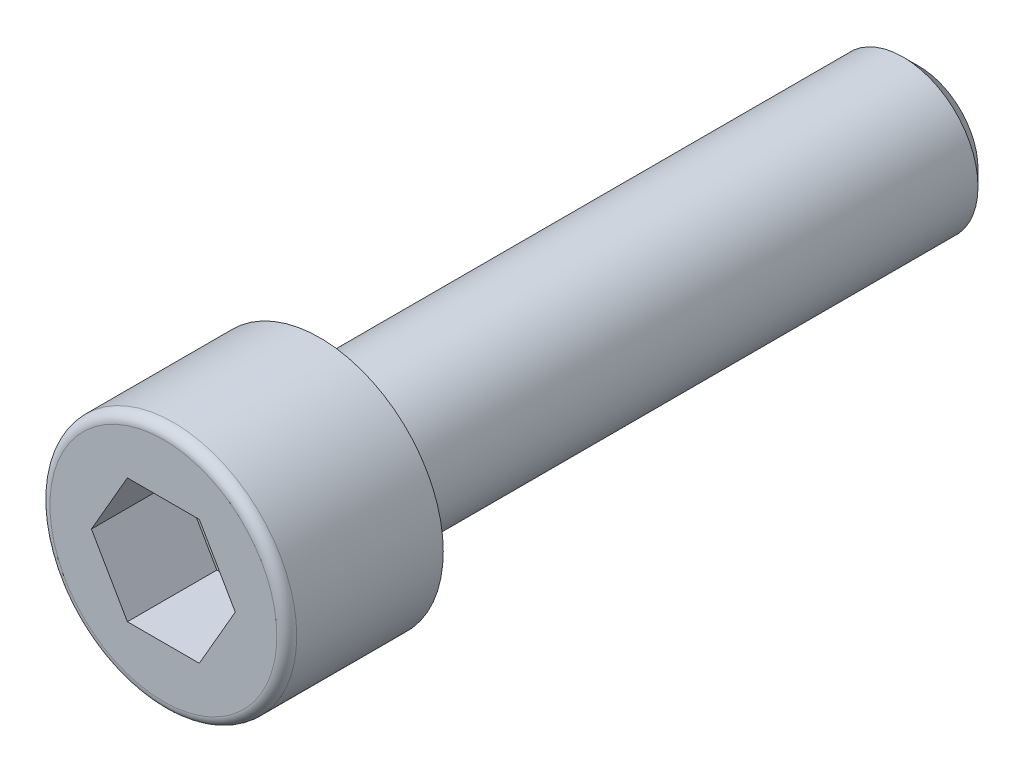
ISO-10303-21;
HEADER;
FILE_DESCRIPTION(('STEP AP214'),'2;1');
FILE_NAME('part.step','',(''),(''),'','','');
FILE_SCHEMA(('AUTOMOTIVE_DESIGN { 1 0 10303 214 1 1 1 1 }'));
ENDSEC;
DATA;
#1=APPLICATION_CONTEXT('core data for automotive mechanical design processes');
#2=APPLICATION_PROTOCOL_DEFINITION('international standard','automotive_design',2000,#1);
#3=PRODUCT_CONTEXT('',#1,'mechanical');
#4=PRODUCT('Part','Part','',(#3));
#5=PRODUCT_RELATED_PRODUCT_CATEGORY('part','',(#4));
#6=PRODUCT_DEFINITION_FORMATION('','',#4);
#7=PRODUCT_DEFINITION_CONTEXT('part definition',#1,'design');
#8=PRODUCT_DEFINITION('design','',#6,#7);
#9=PRODUCT_DEFINITION_SHAPE('','',#8);
#10=(LENGTH_UNIT() NAMED_UNIT(*) SI_UNIT(.MILLI.,.METRE.));
#11=(NAMED_UNIT(*) PLANE_ANGLE_UNIT() SI_UNIT($,.RADIAN.));
#12=(NAMED_UNIT(*) SI_UNIT($,.STERADIAN.) SOLID_ANGLE_UNIT());
#13=UNCERTAINTY_MEASURE_WITH_UNIT(LENGTH_MEASURE(1.E-05),#10,'distance_accuracy_value','');
#14=(GEOMETRIC_REPRESENTATION_CONTEXT(3) GLOBAL_UNCERTAINTY_ASSIGNED_CONTEXT((#13)) GLOBAL_UNIT_ASSIGNED_CONTEXT((#10,
#11,#12)) REPRESENTATION_CONTEXT('',''));
#15=CARTESIAN_POINT('',(0.,0.,0.));
#16=DIRECTION('',(0.,0.,1.));
#17=DIRECTION('',(1.,0.,0.));
#18=AXIS2_PLACEMENT_3D('',#15,#16,#17);
#19=CARTESIAN_POINT('',(0.,0.,2.1336));
#20=DIRECTION('',(0.,0.,1.));
#21=DIRECTION('',(1.,0.,0.));
#22=AXIS2_PLACEMENT_3D('',#19,#20,#21);
#23=PLANE('',#22);
#24=DIRECTION('',(0.500000000000017,-0.866025403784429,0.));
#25=VECTOR('',#24,1.);
#26=CARTESIAN_POINT('',(2.28769270663693,0.,2.1336));
#27=LINE('',#26,#25);
#28=CARTESIAN_POINT('',(1.14384635331845,1.98119999999999,2.1336));
#29=VERTEX_POINT('',#28);
#30=CARTESIAN_POINT('',(2.28769270663695,0.,2.1336));
#31=VERTEX_POINT('',#30);
#32=EDGE_CURVE('E188',#29,#31,#27,.T.);
#33=ORIENTED_EDGE('',*,*,#32,.F.);
#34=DIRECTION('',(1.,0.,0.));
#35=VECTOR('',#34,1.);
#36=CARTESIAN_POINT('',(1.14384635331847,1.9812,2.1336));
#37=LINE('',#36,#35);
#38=CARTESIAN_POINT('',(-1.14384635331847,1.9812,2.1336));
#39=VERTEX_POINT('',#38);
#40=EDGE_CURVE('E193',#39,#29,#37,.T.);
#41=ORIENTED_EDGE('',*,*,#40,.F.);
#42=DIRECTION('',(0.500000000000017,0.866025403784429,0.));
#43=VECTOR('',#42,1.);
#44=CARTESIAN_POINT('',(-1.14384635331847,1.9812,2.1336));
#45=LINE('',#44,#43);
#46=CARTESIAN_POINT('',(-2.28769270663695,0.,2.1336));
#47=VERTEX_POINT('',#46);
#48=EDGE_CURVE('E84',#47,#39,#45,.T.);
#49=ORIENTED_EDGE('',*,*,#48,.F.);
#50=DIRECTION('',(-0.500000000000017,0.866025403784429,0.));
#51=VECTOR('',#50,1.);
#52=CARTESIAN_POINT('',(-2.28769270663693,0.,2.1336));
#53=LINE('',#52,#51);
#54=CARTESIAN_POINT('',(-1.14384635331845,-1.98119999999999,2.1336));
#55=VERTEX_POINT('',#54);
#56=EDGE_CURVE('E65',#55,#47,#53,.T.);
#57=ORIENTED_EDGE('',*,*,#56,.F.);
#58=DIRECTION('',(1.,0.,0.));
#59=VECTOR('',#58,1.);
#60=CARTESIAN_POINT('',(-1.14384635331847,-1.9812,2.1336));
#61=LINE('',#60,#59);
#62=CARTESIAN_POINT('',(1.14384635331847,-1.9812,2.1336));
#63=VERTEX_POINT('',#62);
#64=EDGE_CURVE('E71',#63,#55,#61,.F.);
#65=ORIENTED_EDGE('',*,*,#64,.F.);
#66=DIRECTION('',(-0.500000000000017,-0.866025403784429,0.));
#67=VECTOR('',#66,1.);
#68=CARTESIAN_POINT('',(1.14384635331847,-1.9812,2.1336));
#69=LINE('',#68,#67);
#70=EDGE_CURVE('E183',#31,#63,#69,.T.);
#71=ORIENTED_EDGE('',*,*,#70,.F.);
#72=EDGE_LOOP('',(#33,#41,#49,#57,#65,#71));
#73=FACE_BOUND('',#72,.T.);
#74=ADVANCED_FACE('F16',(#73),#23,.T.);
#75=CARTESIAN_POINT('',(-1.14384635331847,-1.9812,4.9784));
#76=DIRECTION('',(0.,1.,0.));
#77=DIRECTION('',(0.,0.,1.));
#78=AXIS2_PLACEMENT_3D('',#75,#76,#77);
#79=PLANE('',#78);
#80=DIRECTION('',(0.,0.,1.));
#81=VECTOR('',#80,1.);
#82=CARTESIAN_POINT('',(-1.14384635331841,-1.98119999999997,4.9784));
#83=LINE('',#82,#81);
#84=CARTESIAN_POINT('',(-1.14384635331845,-1.98119999999999,4.9784));
#85=VERTEX_POINT('',#84);
#86=EDGE_CURVE('E74',#85,#55,#83,.F.);
#87=ORIENTED_EDGE('',*,*,#86,.F.);
#88=DIRECTION('',(1.,0.,0.));
#89=VECTOR('',#88,1.);
#90=CARTESIAN_POINT('',(0.,-1.9812,4.9784));
#91=LINE('',#90,#89);
#92=CARTESIAN_POINT('',(1.14384635331847,-1.9812,4.9784));
#93=VERTEX_POINT('',#92);
#94=EDGE_CURVE('E172',#93,#85,#91,.F.);
#95=ORIENTED_EDGE('',*,*,#94,.F.);
#96=DIRECTION('',(0.,0.,1.));
#97=VECTOR('',#96,1.);
#98=CARTESIAN_POINT('',(1.14384635331847,-1.9812,4.9784));
#99=LINE('',#98,#97);
#100=EDGE_CURVE('E77',#63,#93,#99,.T.);
#101=ORIENTED_EDGE('',*,*,#100,.F.);
#102=ORIENTED_EDGE('',*,*,#64,.T.);
#103=EDGE_LOOP('',(#87,#95,#101,#102));
#104=FACE_BOUND('',#103,.T.);
#105=ADVANCED_FACE('F72',(#104),#79,.T.);
#106=CARTESIAN_POINT('',(-2.28769270663693,0.,4.9784));
#107=DIRECTION('',(0.866025403784429,0.500000000000017,0.));
#108=DIRECTION('',(-0.500000000000017,0.866025403784429,0.));
#109=AXIS2_PLACEMENT_3D('',#106,#107,#108);
#110=PLANE('',#109);
#111=DIRECTION('',(0.,0.,1.));
#112=VECTOR('',#111,1.);
#113=CARTESIAN_POINT('',(-2.28769270663699,0.,4.9784));
#114=LINE('',#113,#112);
#115=CARTESIAN_POINT('',(-2.28769270663695,0.,4.9784));
#116=VERTEX_POINT('',#115);
#117=EDGE_CURVE('E86',#116,#47,#114,.F.);
#118=ORIENTED_EDGE('',*,*,#117,.F.);
#119=DIRECTION('',(-0.499999999999993,0.866025403784443,0.));
#120=VECTOR('',#119,1.);
#121=CARTESIAN_POINT('',(-1.14384635331847,-1.9812,4.9784));
#122=LINE('',#121,#120);
#123=EDGE_CURVE('E90',#85,#116,#122,.T.);
#124=ORIENTED_EDGE('',*,*,#123,.F.);
#125=ORIENTED_EDGE('',*,*,#86,.T.);
#126=ORIENTED_EDGE('',*,*,#56,.T.);
#127=EDGE_LOOP('',(#118,#124,#125,#126));
#128=FACE_BOUND('',#127,.T.);
#129=ADVANCED_FACE('F88',(#128),#110,.T.);
#130=CARTESIAN_POINT('',(-1.14384635331847,1.9812,4.9784));
#131=DIRECTION('',(0.866025403784429,-0.500000000000017,0.));
#132=DIRECTION('',(0.500000000000017,0.866025403784429,0.));
#133=AXIS2_PLACEMENT_3D('',#130,#131,#132);
#134=PLANE('',#133);
#135=DIRECTION('',(0.,0.,-1.));
#136=VECTOR('',#135,1.);
#137=CARTESIAN_POINT('',(-1.14384635331847,1.9812,4.9784));
#138=LINE('',#137,#136);
#139=CARTESIAN_POINT('',(-1.14384635331847,1.9812,4.9784));
#140=VERTEX_POINT('',#139);
#141=EDGE_CURVE('E195',#140,#39,#138,.T.);
#142=ORIENTED_EDGE('',*,*,#141,.F.);
#143=DIRECTION('',(0.499999999999993,0.866025403784443,0.));
#144=VECTOR('',#143,1.);
#145=CARTESIAN_POINT('',(-2.28769270663693,0.,4.9784));
#146=LINE('',#145,#144);
#147=EDGE_CURVE('E168',#116,#140,#146,.T.);
#148=ORIENTED_EDGE('',*,*,#147,.F.);
#149=ORIENTED_EDGE('',*,*,#117,.T.);
#150=ORIENTED_EDGE('',*,*,#48,.T.);
#151=EDGE_LOOP('',(#142,#148,#149,#150));
#152=FACE_BOUND('',#151,.T.);
#153=ADVANCED_FACE('F201',(#152),#134,.T.);
#154=CARTESIAN_POINT('',(1.14384635331847,1.9812,4.9784));
#155=DIRECTION('',(0.,-1.,0.));
#156=DIRECTION('',(0.,0.,-1.));
#157=AXIS2_PLACEMENT_3D('',#154,#155,#156);
#158=PLANE('',#157);
#159=DIRECTION('',(0.,0.,1.));
#160=VECTOR('',#159,1.);
#161=CARTESIAN_POINT('',(1.14384635331841,1.98119999999997,4.9784));
#162=LINE('',#161,#160);
#163=CARTESIAN_POINT('',(1.14384635331845,1.98119999999999,4.9784));
#164=VERTEX_POINT('',#163);
#165=EDGE_CURVE('E190',#164,#29,#162,.F.);
#166=ORIENTED_EDGE('',*,*,#165,.F.);
#167=DIRECTION('',(1.,0.,0.));
#168=VECTOR('',#167,1.);
#169=CARTESIAN_POINT('',(0.,1.9812,4.9784));
#170=LINE('',#169,#168);
#171=EDGE_CURVE('E165',#140,#164,#170,.T.);
#172=ORIENTED_EDGE('',*,*,#171,.F.);
#173=ORIENTED_EDGE('',*,*,#141,.T.);
#174=ORIENTED_EDGE('',*,*,#40,.T.);
#175=EDGE_LOOP('',(#166,#172,#173,#174));
#176=FACE_BOUND('',#175,.T.);
#177=ADVANCED_FACE('F220',(#176),#158,.T.);
#178=CARTESIAN_POINT('',(2.28769270663693,0.,4.9784));
#179=DIRECTION('',(-0.866025403784429,-0.500000000000017,0.));
#180=DIRECTION('',(0.500000000000017,-0.866025403784429,0.));
#181=AXIS2_PLACEMENT_3D('',#178,#179,#180);
#182=PLANE('',#181);
#183=DIRECTION('',(0.,0.,1.));
#184=VECTOR('',#183,1.);
#185=CARTESIAN_POINT('',(2.28769270663699,0.,4.9784));
#186=LINE('',#185,#184);
#187=CARTESIAN_POINT('',(2.28769270663695,0.,4.9784));
#188=VERTEX_POINT('',#187);
#189=EDGE_CURVE('E185',#188,#31,#186,.F.);
#190=ORIENTED_EDGE('',*,*,#189,.F.);
#191=DIRECTION('',(0.499999999999993,-0.866025403784443,0.));
#192=VECTOR('',#191,1.);
#193=CARTESIAN_POINT('',(1.14384635331847,1.9812,4.9784));
#194=LINE('',#193,#192);
#195=EDGE_CURVE('E162',#164,#188,#194,.T.);
#196=ORIENTED_EDGE('',*,*,#195,.F.);
#197=ORIENTED_EDGE('',*,*,#165,.T.);
#198=ORIENTED_EDGE('',*,*,#32,.T.);
#199=EDGE_LOOP('',(#190,#196,#197,#198));
#200=FACE_BOUND('',#199,.T.);
#201=ADVANCED_FACE('F217',(#200),#182,.T.);
#202=CARTESIAN_POINT('',(1.14384635331847,-1.9812,4.9784));
#203=DIRECTION('',(-0.866025403784429,0.500000000000017,0.));
#204=DIRECTION('',(-0.500000000000017,-0.866025403784429,0.));
#205=AXIS2_PLACEMENT_3D('',#202,#203,#204);
#206=PLANE('',#205);
#207=ORIENTED_EDGE('',*,*,#100,.T.);
#208=DIRECTION('',(-0.499999999999993,-0.866025403784443,0.));
#209=VECTOR('',#208,1.);
#210=CARTESIAN_POINT('',(2.28769270663693,0.,4.9784));
#211=LINE('',#210,#209);
#212=EDGE_CURVE('E154',#188,#93,#211,.T.);
#213=ORIENTED_EDGE('',*,*,#212,.F.);
#214=ORIENTED_EDGE('',*,*,#189,.T.);
#215=ORIENTED_EDGE('',*,*,#70,.T.);
#216=EDGE_LOOP('',(#207,#213,#214,#215));
#217=FACE_BOUND('',#216,.T.);
#218=ADVANCED_FACE('F211',(#217),#206,.T.);
#219=CARTESIAN_POINT('',(0.,0.,4.9784));
#220=DIRECTION('',(0.,0.,1.));
#221=DIRECTION('',(1.,0.,0.));
#222=AXIS2_PLACEMENT_3D('',#219,#220,#221);
#223=PLANE('',#222);
#224=ORIENTED_EDGE('',*,*,#195,.T.);
#225=ORIENTED_EDGE('',*,*,#212,.T.);
#226=ORIENTED_EDGE('',*,*,#94,.T.);
#227=ORIENTED_EDGE('',*,*,#123,.T.);
#228=ORIENTED_EDGE('',*,*,#147,.T.);
#229=ORIENTED_EDGE('',*,*,#171,.T.);
#230=EDGE_LOOP('',(#224,#225,#226,#227,#228,#229));
#231=FACE_BOUND('',#230,.T.);
#232=CARTESIAN_POINT('',(3.6068,0.,4.9784));
#233=CARTESIAN_POINT('',(3.6068001367076,-0.047190426347018,4.97839999982396));
#234=CARTESIAN_POINT('',(3.60588066314262,-0.0943809285426263,4.97840000037131));
#235=CARTESIAN_POINT('',(3.60220505214464,-0.188689379793766,4.97839999825081));
#236=CARTESIAN_POINT('',(3.5994489523749,-0.235807330317238,4.97839999558302));
#237=CARTESIAN_POINT('',(3.59210267784879,-0.329899499595504,4.97839998237069));
#238=CARTESIAN_POINT('',(3.58751251927362,-0.376873719614692,4.97839997182621));
#239=CARTESIAN_POINT('',(3.57651079977954,-0.470608831406809,4.97839991656409));
#240=CARTESIAN_POINT('',(3.57009923365033,-0.517369722569103,4.97839987184635));
#241=CARTESIAN_POINT('',(3.55544341096198,-0.610603579048789,4.97839977541145));
#242=CARTESIAN_POINT('',(3.54719912775222,-0.657076540169119,4.97839972369419));
#243=CARTESIAN_POINT('',(3.53157279649309,-0.736451898601512,4.97839945919678));
#244=CARTESIAN_POINT('',(3.52461725397312,-0.769438375502449,4.97839929664927));
#245=CARTESIAN_POINT('',(3.5165181002265,-0.80501580331488,4.97839926285234));
#246=CARTESIAN_POINT('',(3.51589724287407,-0.807726506359746,4.97839926117042));
#247=CARTESIAN_POINT('',(3.5088916898072,-0.838128384067128,4.97839925332539));
#248=CARTESIAN_POINT('',(3.50213629140647,-0.865734263359462,4.97839934879465));
#249=CARTESIAN_POINT('',(3.48074624347716,-0.948928109400097,4.97839959007035));
#250=CARTESIAN_POINT('',(3.46511823427229,-1.00426389830168,4.97839968752396));
#251=CARTESIAN_POINT('',(3.43463133097737,-1.10304322672148,4.9783998450099));
#252=CARTESIAN_POINT('',(3.42025238274511,-1.14663556225889,4.97839990862565));
#253=CARTESIAN_POINT('',(3.39811042711489,-1.20972351008006,4.97839996227232));
#254=CARTESIAN_POINT('',(3.39099530371253,-1.22944862334467,4.97839997350312));
#255=CARTESIAN_POINT('',(3.36699189529756,-1.29426062790835,4.97839999898762));
#256=CARTESIAN_POINT('',(3.34938842189432,-1.33908531015371,4.97839999829507));
#257=CARTESIAN_POINT('',(3.31285897916932,-1.42700400916477,4.97839999949051));
#258=CARTESIAN_POINT('',(3.29397198491927,-1.4701142309087,4.97840000132041));
#259=CARTESIAN_POINT('',(3.26597111814146,-1.53086019129832,4.97839998536702));
#260=CARTESIAN_POINT('',(3.25752415948773,-1.54880575502986,4.97839997831742));
#261=CARTESIAN_POINT('',(3.23226276882305,-1.60135295414566,4.97839994678065));
#262=CARTESIAN_POINT('',(3.21504381494913,-1.63576103044311,4.97839991213277));
#263=CARTESIAN_POINT('',(3.17014319609929,-1.72199075621588,4.97839980395734));
#264=CARTESIAN_POINT('',(3.14172975789274,-1.77343355042996,4.97839971956297));
#265=CARTESIAN_POINT('',(3.0879257464539,-1.86543601113271,4.97839955655695));
#266=CARTESIAN_POINT('',(3.06295443969165,-1.90624183347306,4.97839947978444));
#267=CARTESIAN_POINT('',(3.01727925404111,-1.9776219418292,4.9783993625337));
#268=CARTESIAN_POINT('',(2.9969023837214,-2.00840556308674,4.97839931777099));
#269=CARTESIAN_POINT('',(2.96492542307568,-2.05509692739006,4.97839929927028));
#270=CARTESIAN_POINT('',(2.95366875448252,-2.07124056272067,4.97839930213111));
#271=CARTESIAN_POINT('',(2.93446062910177,-2.09829576561279,4.97839932707517));
#272=CARTESIAN_POINT('',(2.92658115689002,-2.1092585585652,4.97839934284073));
#273=CARTESIAN_POINT('',(2.89084866634083,-2.158387024395,4.9783994151151));
#274=CARTESIAN_POINT('',(2.86230159255335,-2.19605223741828,4.97839947496085));
#275=CARTESIAN_POINT('',(2.80374076125102,-2.27021758651936,4.97839960725055));
#276=CARTESIAN_POINT('',(2.77372711098397,-2.30671780746895,4.97839967969357));
#277=CARTESIAN_POINT('',(2.71228322730175,-2.37850132032869,4.97839981459096));
#278=CARTESIAN_POINT('',(2.68085311347543,-2.41378471453046,4.97839987704617));
#279=CARTESIAN_POINT('',(2.61661824664382,-2.48307050723132,4.97839996951477));
#280=CARTESIAN_POINT('',(2.5838136252347,-2.51707302777275,4.97839999953127));
#281=CARTESIAN_POINT('',(2.51690450680968,-2.58377936011759,4.9784000004687));
#282=CARTESIAN_POINT('',(2.48279989435886,-2.6164830560607,4.97839997138437));
#283=CARTESIAN_POINT('',(2.41337593074553,-2.68056281874415,4.97839994173297));
#284=CARTESIAN_POINT('',(2.37805677154153,-2.71193909355034,4.97839994116143));
#285=CARTESIAN_POINT('',(2.30625106141278,-2.77331906091041,4.97839995543555));
#286=CARTESIAN_POINT('',(2.26976464449702,-2.80332291007374,4.97839997027946));
#287=CARTESIAN_POINT('',(2.19566263226596,-2.86189311796164,4.97840002321189));
#288=CARTESIAN_POINT('',(2.15804711783393,-2.89045957926346,4.97840006129875));
#289=CARTESIAN_POINT('',(2.08179958724618,-2.94620750123822,4.97839975558131));
#290=CARTESIAN_POINT('',(2.04316760013027,-2.97338900141338,4.97839941178791));
#291=CARTESIAN_POINT('',(1.98242669885874,-3.01411041779638,4.97839919984435));
#292=CARTESIAN_POINT('',(1.96073137447092,-3.02826936630226,4.97839918703746));
#293=CARTESIAN_POINT('',(1.89333001744297,-3.07118981987794,4.97839923518642));
#294=CARTESIAN_POINT('',(1.8471004529677,-3.0991353516967,4.9783993911977));
#295=CARTESIAN_POINT('',(1.76771544356276,-3.14471538702889,4.97839960654465));
#296=CARTESIAN_POINT('',(1.73487117936698,-3.16289588604624,4.97839968085326));
#297=CARTESIAN_POINT('',(1.67174906011925,-3.19655756353544,4.97839980391334));
#298=CARTESIAN_POINT('',(1.64152075584278,-3.21213171917597,4.97839985441244));
#299=CARTESIAN_POINT('',(1.56401633015602,-3.25069088846162,4.97839995140869));
#300=CARTESIAN_POINT('',(1.51644177507768,-3.27308044788063,4.97839998067309));
#301=CARTESIAN_POINT('',(1.43918402616268,-3.30742445931265,4.97839999927046));
#302=CARTESIAN_POINT('',(1.4097884321649,-3.32003248124294,4.97839999975134));
#303=CARTESIAN_POINT('',(1.33659720741285,-3.35031502184164,4.97840000036714));
#304=CARTESIAN_POINT('',(1.29261455313216,-3.36754091465109,4.97840000022799));
#305=CARTESIAN_POINT('',(1.20401244105773,-3.40026022687712,4.97839999952856));
#306=CARTESIAN_POINT('',(1.15939300870086,-3.41575371527948,4.97839999896828));
#307=CARTESIAN_POINT('',(1.06958791643787,-3.44499909226055,4.97839998170873));
#308=CARTESIAN_POINT('',(1.02440226948031,-3.45875102058679,4.97839996500982));
#309=CARTESIAN_POINT('',(0.93353050830876,-3.48448613354047,4.97839989799392));
#310=CARTESIAN_POINT('',(0.887844397009131,-3.49646932846193,4.97839984767713));
#311=CARTESIAN_POINT('',(0.796042820953665,-3.51866262589805,4.9783996496823));
#312=CARTESIAN_POINT('',(0.749927351401408,-3.52887270857992,4.97839950200317));
#313=CARTESIAN_POINT('',(0.657324998937565,-3.54745789702974,4.97839916274184));
#314=CARTESIAN_POINT('',(0.610838098741305,-3.55583291688073,4.97839897115758));
#315=CARTESIAN_POINT('',(0.517567167615624,-3.57068618695519,4.97839874974133));
#316=CARTESIAN_POINT('',(0.47078316889769,-3.57716463933524,4.97839871989209));
#317=CARTESIAN_POINT('',(0.376999042547272,-3.58822710585865,4.97839881145553));
#318=CARTESIAN_POINT('',(0.329998948615463,-3.59281140590203,4.97839893284537));
#319=CARTESIAN_POINT('',(0.235860972832814,-3.60007521539162,4.97839927128909));
#320=CARTESIAN_POINT('',(0.188723119693348,-3.60275509677474,4.97839948832428));
#321=CARTESIAN_POINT('',(0.0943889422856737,-3.6062078403022,4.97839984519577));
#322=CARTESIAN_POINT('',(0.0471926347431628,-3.60698115944764,4.97839998505056));
#323=CARTESIAN_POINT('',(0.,-3.6068,4.9784));
#324=B_SPLINE_CURVE_WITH_KNOTS('',3,(#232,#233,#234,#235,#236,#237,#238,#239,#240,#241,#242,
#243,#244,#245,#246,#247,#248,#249,#250,#251,#252,#253,#254,#255,#256,#257,#258,#259,#260,#261,
#262,#263,#264,#265,#266,#267,#268,#269,#270,#271,#272,#273,#274,#275,#276,#277,#278,#279,#280,
#281,#282,#283,#284,#285,#286,#287,#288,#289,#290,#291,#292,#293,#294,#295,#296,#297,#298,#299,
#300,#301,#302,#303,#304,#305,#306,#307,#308,#309,#310,#311,#312,#313,#314,#315,#316,#317,#318,
#319,#320,#321,#322,#323),.UNSPECIFIED.,.F.,.F.,(4,2,2,2,2,2,2,2,2,2,2,2,2,2,2,2,2,2,2,2,2,2,2,
2,2,2,2,2,2,2,2,2,2,2,2,2,2,2,2,2,2,2,2,2,2,4),(0.,0.141562490309025,0.283122077718243,
0.424680416229242,0.566239159683742,0.707799961761261,0.808920127477082,0.817262807781978,
0.902515895989745,1.07494548541992,1.2126183454937,1.2755238088135,1.41995586965031,
1.56111725553646,1.62061793900453,1.73602684549926,1.91225433388759,2.05573790609618,
2.1664694965023,2.22550880403049,2.26601041860694,2.40775169781276,2.54948262722973,
2.6912016129561,2.8329070612881,2.97462512204328,3.11632088635552,3.25800044101592,
3.39966987052338,3.54133525703487,3.61904998997181,3.78104411507306,3.89364843811646,
3.99564984021867,4.15333207632595,4.24928001747358,4.3909489724517,4.53261228404337,
4.67427236187755,4.81593161521791,4.95759245295679,5.09925992178569,5.24091228466643,
5.38254325897176,5.52414656484593,5.66571592524397),.UNSPECIFIED.);
#325=CARTESIAN_POINT('',(3.6068,0.,4.9784));
#326=VERTEX_POINT('',#325);
#327=CARTESIAN_POINT('',(0.,-3.6068,4.9784));
#328=VERTEX_POINT('',#327);
#329=EDGE_CURVE('E36',#326,#328,#324,.T.);
#330=ORIENTED_EDGE('',*,*,#329,.F.);
#331=CARTESIAN_POINT('',(0.,3.6068,4.9784));
#332=CARTESIAN_POINT('',(0.0471904263470077,3.60680013670759,4.97839999982396));
#333=CARTESIAN_POINT('',(0.0943809285426076,3.60588066314262,4.97840000037131));
#334=CARTESIAN_POINT('',(0.188689379793731,3.60220505214464,4.97839999825081));
#335=CARTESIAN_POINT('',(0.235807330317195,3.5994489523749,4.97839999558302));
#336=CARTESIAN_POINT('',(0.32989949959544,3.59210267784878,4.97839998237069));
#337=CARTESIAN_POINT('',(0.376873719614616,3.5875125192736,4.97839997182621));
#338=CARTESIAN_POINT('',(0.470608831406725,3.57651079977956,4.97839991656409));
#339=CARTESIAN_POINT('',(0.517369722569024,3.57009923365042,4.97839987184635));
#340=CARTESIAN_POINT('',(0.610603579048653,3.5554434109619,4.97839977541145));
#341=CARTESIAN_POINT('',(0.657076540168922,3.54719912775191,4.97839972369419));
#342=CARTESIAN_POINT('',(0.736451898601421,3.53157279649331,4.97839945919678));
#343=CARTESIAN_POINT('',(0.769438375502467,3.52461725397385,4.97839929664926));
#344=CARTESIAN_POINT('',(0.805015803274071,3.51651810023569,4.97839926285234));
#345=CARTESIAN_POINT('',(0.807726506278302,3.51589724289255,4.97839926117042));
#346=CARTESIAN_POINT('',(0.838128383874101,3.50889168985191,4.97839925332539));
#347=CARTESIAN_POINT('',(0.86573426309599,3.50213629147028,4.97839934879465));
#348=CARTESIAN_POINT('',(0.948928109107229,3.48074624355695,4.97839959007035));
#349=CARTESIAN_POINT('',(1.00426389804912,3.46511823434554,4.97839968752396));
#350=CARTESIAN_POINT('',(1.10304322658047,3.43463133102332,4.9783998450099));
#351=CARTESIAN_POINT('',(1.14663556218881,3.42025238276943,4.97839990862565));
#352=CARTESIAN_POINT('',(1.2097235101145,3.39811042710288,4.97839996227232));
#353=CARTESIAN_POINT('',(1.22944862341343,3.39099530368792,4.97839997350312));
#354=CARTESIAN_POINT('',(1.29426062804369,3.36699189524633,4.97839999898762));
#355=CARTESIAN_POINT('',(1.33908531032098,3.34938842182826,4.97839999829507));
#356=CARTESIAN_POINT('',(1.42700400932982,3.31285897909803,4.97839999949051));
#357=CARTESIAN_POINT('',(1.47011423104066,3.2939719848601,4.97840000132041));
#358=CARTESIAN_POINT('',(1.53086019136427,3.26597111811044,4.97839998536702));
#359=CARTESIAN_POINT('',(1.54880575506259,3.25752415947202,4.97839997831742));
#360=CARTESIAN_POINT('',(1.60135295421257,3.23226276879088,4.97839994678065));
#361=CARTESIAN_POINT('',(1.63576103057617,3.21504381488253,4.97839991213277));
#362=CARTESIAN_POINT('',(1.72199075647903,3.1701431959582,4.97839980395734));
#363=CARTESIAN_POINT('',(1.77343355075641,3.14172975771045,4.97839971956296));
#364=CARTESIAN_POINT('',(1.86543601152174,3.08792574621965,4.97839955655695));
#365=CARTESIAN_POINT('',(1.9062418338632,3.06295443944962,4.97839947978444));
#366=CARTESIAN_POINT('',(1.97762194216271,3.01727925382236,4.9783993625337));
#367=CARTESIAN_POINT('',(2.00840556336375,2.99690238353555,4.97839931777099));
#368=CARTESIAN_POINT('',(2.05509692753677,2.96492542297367,4.97839929927028));
#369=CARTESIAN_POINT('',(2.07124056279337,2.95366875443107,4.97839930213111));
#370=CARTESIAN_POINT('',(2.09829576561224,2.93446062910197,4.97839932707517));
#371=CARTESIAN_POINT('',(2.10925855856455,2.92658115689009,4.97839934284073));
#372=CARTESIAN_POINT('',(2.15838702439393,2.89084866634039,4.97839941511511));
#373=CARTESIAN_POINT('',(2.196052237417,2.86230159255269,4.97839947496085));
#374=CARTESIAN_POINT('',(2.27021758651783,2.80374076125008,4.97839960725055));
#375=CARTESIAN_POINT('',(2.30671780746737,2.77372711098297,4.97839967969357));
#376=CARTESIAN_POINT('',(2.3785013203272,2.71228322730079,4.97839981459096));
#377=CARTESIAN_POINT('',(2.41378471452911,2.68085311347458,4.97839987704617));
#378=CARTESIAN_POINT('',(2.4830705072305,2.61661824664336,4.97839996951477));
#379=CARTESIAN_POINT('',(2.51707302777234,2.58381362523454,4.97839999953127));
#380=CARTESIAN_POINT('',(2.58377936011791,2.51690450681018,4.9784000004687));
#381=CARTESIAN_POINT('',(2.61648305606135,2.48279989435973,4.97839997138437));
#382=CARTESIAN_POINT('',(2.68056281874532,2.41337593074694,4.97839994173298));
#383=CARTESIAN_POINT('',(2.71193909355168,2.3780567715431,4.97839994116143));
#384=CARTESIAN_POINT('',(2.77331906091192,2.30625106141447,4.97839995543555));
#385=CARTESIAN_POINT('',(2.80332291007526,2.26976464449868,4.97839997027946));
#386=CARTESIAN_POINT('',(2.86189311796316,2.19566263226751,4.97840002321189));
#387=CARTESIAN_POINT('',(2.89045957926498,2.1580471178354,4.97840006129875));
#388=CARTESIAN_POINT('',(2.94620750123894,2.08179958724696,4.97839975558131));
#389=CARTESIAN_POINT('',(2.97338900141329,2.04316760013043,4.97839941178791));
#390=CARTESIAN_POINT('',(3.01411041785152,1.98242669877728,4.97839919984434));
#391=CARTESIAN_POINT('',(3.02826936641065,1.96073137430661,4.97839918703746));
#392=CARTESIAN_POINT('',(3.07118982001653,1.89333001722003,4.97839923518641));
#393=CARTESIAN_POINT('',(3.09913535181484,1.84710045277077,4.9783993911977));
#394=CARTESIAN_POINT('',(3.14471538709311,1.76771544344841,4.97839960654465));
#395=CARTESIAN_POINT('',(3.16289588607751,1.73487117930946,4.97839968085326));
#396=CARTESIAN_POINT('',(3.19655756348441,1.67174906021489,4.97839980391334));
#397=CARTESIAN_POINT('',(3.21213171907648,1.64152075603524,4.97839985441244));
#398=CARTESIAN_POINT('',(3.25069088829629,1.56401633049708,4.97839995140869));
#399=CARTESIAN_POINT('',(3.27308044769739,1.5164417754702,4.97839998067309));
#400=CARTESIAN_POINT('',(3.30742445918405,1.43918402646104,4.97839999927046));
#401=CARTESIAN_POINT('',(3.32003248118058,1.409788432315,4.97839999975134));
#402=CARTESIAN_POINT('',(3.35031502184209,1.33659720741327,4.97840000036714));
#403=CARTESIAN_POINT('',(3.36754091465197,1.29261455313276,4.97840000022799));
#404=CARTESIAN_POINT('',(3.40026022687862,1.20401244105855,4.97839999952856));
#405=CARTESIAN_POINT('',(3.41575371528119,1.15939300870171,4.97839999896828));
#406=CARTESIAN_POINT('',(3.44499909226247,1.0695879164387,4.97839998170873));
#407=CARTESIAN_POINT('',(3.45875102058873,1.02440226948108,4.97839996500982));
#408=CARTESIAN_POINT('',(3.48448613354223,0.933530508309329,4.97839989799392));
#409=CARTESIAN_POINT('',(3.4964693284635,0.887844397009562,4.97839984767713));
#410=CARTESIAN_POINT('',(3.51866262589897,0.79604282095376,4.9783996496823));
#411=CARTESIAN_POINT('',(3.52887270858039,0.749927351401303,4.97839950200317));
#412=CARTESIAN_POINT('',(3.54745789702924,0.657324998937255,4.97839916274184));
#413=CARTESIAN_POINT('',(3.55583291687974,0.610838098740993,4.97839897115758));
#414=CARTESIAN_POINT('',(3.57068618695348,0.517567167615353,4.97839874974133));
#415=CARTESIAN_POINT('',(3.57716463933331,0.470783168897462,4.9783987198921));
#416=CARTESIAN_POINT('',(3.58822710585651,0.376999042547137,4.97839881145554));
#417=CARTESIAN_POINT('',(3.59281140589989,0.329998948615376,4.97839893284537));
#418=CARTESIAN_POINT('',(3.6000752153897,0.235860972832806,4.97839927128909));
#419=CARTESIAN_POINT('',(3.60275509677305,0.188723119693372,4.97839948832429));
#420=CARTESIAN_POINT('',(3.60620784030119,0.0943889422857142,4.97839984519577));
#421=CARTESIAN_POINT('',(3.60698115944708,0.047192634743189,4.97839998505056));
#422=CARTESIAN_POINT('',(3.6068,0.,4.9784));
#423=B_SPLINE_CURVE_WITH_KNOTS('',3,(#331,#332,#333,#334,#335,#336,#337,#338,#339,#340,#341,
#342,#343,#344,#345,#346,#347,#348,#349,#350,#351,#352,#353,#354,#355,#356,#357,#358,#359,#360,
#361,#362,#363,#364,#365,#366,#367,#368,#369,#370,#371,#372,#373,#374,#375,#376,#377,#378,#379,
#380,#381,#382,#383,#384,#385,#386,#387,#388,#389,#390,#391,#392,#393,#394,#395,#396,#397,#398,
#399,#400,#401,#402,#403,#404,#405,#406,#407,#408,#409,#410,#411,#412,#413,#414,#415,#416,#417,
#418,#419,#420,#421,#422),.UNSPECIFIED.,.F.,.F.,(4,2,2,2,2,2,2,2,2,2,2,2,2,2,2,2,2,2,2,2,2,2,2,
2,2,2,2,2,2,2,2,2,2,2,2,2,2,2,2,2,2,2,2,2,2,4),(0.,0.141562490308998,0.28312207771819,
0.424680416229161,0.566239159683636,0.707799961761126,0.80892012747693,0.817262807656779,
0.902515895645728,1.07494548519744,1.21261834549349,1.27552380892296,1.41995586986508,
1.5611172556458,1.62061793900413,1.73602684572243,1.91225433433644,2.05573790656004,
2.16646949677044,2.22550880402978,2.26601041860619,2.40775169781193,2.54948262722891,
2.69120161295541,2.83290706128766,2.97462512204272,3.11632088635494,3.25800044101542,
3.39966987052302,3.54133525703469,3.61904999026704,3.78104411526986,3.89364843811634,
3.99564983989388,4.15333207583884,4.24928001747341,4.39094897245151,4.53261228404326,
4.67427236187762,4.81593161521822,4.95759245295738,5.09925992178604,5.24091228466657,
5.38254325897177,5.52414656484588,5.665715925244),.UNSPECIFIED.);
#424=CARTESIAN_POINT('',(0.,3.6068,4.9784));
#425=VERTEX_POINT('',#424);
#426=EDGE_CURVE('E103',#425,#326,#423,.T.);
#427=ORIENTED_EDGE('',*,*,#426,.F.);
#428=CARTESIAN_POINT('',(0.,0.,4.9784));
#429=DIRECTION('',(0.,0.,-1.));
#430=DIRECTION('',(0.,-1.,0.));
#431=AXIS2_PLACEMENT_3D('',#428,#429,#430);
#432=CIRCLE('',#431,3.6068);
#433=EDGE_CURVE('E132',#328,#425,#432,.T.);
#434=ORIENTED_EDGE('',*,*,#433,.F.);
#435=EDGE_LOOP('',(#330,#427,#434));
#436=FACE_BOUND('',#435,.T.);
#437=ADVANCED_FACE('F118',(#231,#436),#223,.T.);
#438=CARTESIAN_POINT('',(0.,0.,4.6609));
#439=DIRECTION('',(0.,0.,1.));
#440=DIRECTION('',(0.,-1.,0.));
#441=AXIS2_PLACEMENT_3D('',#438,#439,#440);
#442=TOROIDAL_SURFACE('',#441,3.6068,0.3175);
#443=CARTESIAN_POINT('',(0.,0.,4.6609));
#444=DIRECTION('',(0.,0.,1.));
#445=DIRECTION('',(1.,0.,0.));
#446=AXIS2_PLACEMENT_3D('',#443,#444,#445);
#447=CIRCLE('',#446,3.9243);
#448=CARTESIAN_POINT('',(3.9243,0.,4.6609));
#449=VERTEX_POINT('',#448);
#450=EDGE_CURVE('E101',#449,#449,#447,.F.);
#451=ORIENTED_EDGE('',*,*,#450,.F.);
#452=EDGE_LOOP('',(#451));
#453=FACE_BOUND('',#452,.T.);
#454=ORIENTED_EDGE('',*,*,#433,.T.);
#455=ORIENTED_EDGE('',*,*,#426,.T.);
#456=ORIENTED_EDGE('',*,*,#329,.T.);
#457=EDGE_LOOP('',(#454,#455,#456));
#458=FACE_BOUND('',#457,.T.);
#459=ADVANCED_FACE('F106',(#453,#458),#442,.T.);
#460=CARTESIAN_POINT('',(0.,0.,-19.05));
#461=DIRECTION('',(0.,0.,-1.));
#462=DIRECTION('',(-1.,0.,0.));
#463=AXIS2_PLACEMENT_3D('',#460,#461,#462);
#464=PLANE('',#463);
#465=CARTESIAN_POINT('',(0.,0.,-19.0499999999929));
#466=DIRECTION('',(0.,0.,1.));
#467=DIRECTION('',(1.,0.,0.));
#468=AXIS2_PLACEMENT_3D('',#465,#466,#467);
#469=CIRCLE('',#468,1.88124999999673);
#470=CARTESIAN_POINT('',(1.88124999999673,0.,-19.0499999999929));
#471=VERTEX_POINT('',#470);
#472=EDGE_CURVE('E98',#471,#471,#469,.T.);
#473=ORIENTED_EDGE('',*,*,#472,.F.);
#474=EDGE_LOOP('',(#473));
#475=FACE_BOUND('',#474,.T.);
#476=ADVANCED_FACE('F117',(#475),#464,.T.);
#477=CARTESIAN_POINT('',(0.,0.,0.));
#478=DIRECTION('',(0.,0.,1.));
#479=DIRECTION('',(1.,0.,0.));
#480=AXIS2_PLACEMENT_3D('',#477,#478,#479);
#481=CYLINDRICAL_SURFACE('',#480,3.9243);
#482=ORIENTED_EDGE('',*,*,#450,.T.);
#483=EDGE_LOOP('',(#482));
#484=FACE_BOUND('',#483,.T.);
#485=CARTESIAN_POINT('',(0.,0.,0.));
#486=DIRECTION('',(0.,0.,1.));
#487=DIRECTION('',(1.,0.,0.));
#488=AXIS2_PLACEMENT_3D('',#485,#486,#487);
#489=CIRCLE('',#488,3.9243);
#490=CARTESIAN_POINT('',(3.9243,0.,0.));
#491=VERTEX_POINT('',#490);
#492=EDGE_CURVE('E95',#491,#491,#489,.F.);
#493=ORIENTED_EDGE('',*,*,#492,.F.);
#494=EDGE_LOOP('',(#493));
#495=FACE_BOUND('',#494,.T.);
#496=ADVANCED_FACE('F245',(#484,#495),#481,.T.);
#497=CARTESIAN_POINT('',(0.,0.,-18.5500000000047));
#498=DIRECTION('',(0.,0.,1.));
#499=DIRECTION('',(1.,0.,0.));
#500=AXIS2_PLACEMENT_3D('',#497,#498,#499);
#501=CONICAL_SURFACE('',#500,2.3812499999849,0.785398163397448);
#502=ORIENTED_EDGE('',*,*,#472,.T.);
#503=EDGE_LOOP('',(#502));
#504=FACE_BOUND('',#503,.T.);
#505=CARTESIAN_POINT('',(0.,0.,-18.5499999999995));
#506=DIRECTION('',(0.,0.,-1.));
#507=DIRECTION('',(-1.,0.,0.));
#508=AXIS2_PLACEMENT_3D('',#505,#506,#507);
#509=CIRCLE('',#508,2.38125);
#510=CARTESIAN_POINT('',(-2.38125,0.,-18.5499999999995));
#511=VERTEX_POINT('',#510);
#512=EDGE_CURVE('E27',#511,#511,#509,.F.);
#513=ORIENTED_EDGE('',*,*,#512,.F.);
#514=EDGE_LOOP('',(#513));
#515=FACE_BOUND('',#514,.T.);
#516=ADVANCED_FACE('F238',(#504,#515),#501,.T.);
#517=CARTESIAN_POINT('',(0.,0.,0.));
#518=DIRECTION('',(0.,0.,-1.));
#519=DIRECTION('',(-1.,0.,0.));
#520=AXIS2_PLACEMENT_3D('',#517,#518,#519);
#521=PLANE('',#520);
#522=CARTESIAN_POINT('',(0.,0.,0.));
#523=DIRECTION('',(0.,0.,-1.));
#524=DIRECTION('',(-1.,0.,0.));
#525=AXIS2_PLACEMENT_3D('',#522,#523,#524);
#526=CIRCLE('',#525,2.38125);
#527=CARTESIAN_POINT('',(-2.38125,0.,0.));
#528=VERTEX_POINT('',#527);
#529=EDGE_CURVE('E11',#528,#528,#526,.T.);
#530=ORIENTED_EDGE('',*,*,#529,.F.);
#531=EDGE_LOOP('',(#530));
#532=FACE_BOUND('',#531,.T.);
#533=ORIENTED_EDGE('',*,*,#492,.T.);
#534=EDGE_LOOP('',(#533));
#535=FACE_BOUND('',#534,.T.);
#536=ADVANCED_FACE('F232',(#532,#535),#521,.T.);
#537=CARTESIAN_POINT('',(0.,0.,0.));
#538=DIRECTION('',(0.,0.,-1.));
#539=DIRECTION('',(-1.,0.,0.));
#540=AXIS2_PLACEMENT_3D('',#537,#538,#539);
#541=CYLINDRICAL_SURFACE('',#540,2.38125);
#542=ORIENTED_EDGE('',*,*,#512,.T.);
#543=EDGE_LOOP('',(#542));
#544=FACE_BOUND('',#543,.T.);
#545=ORIENTED_EDGE('',*,*,#529,.T.);
#546=EDGE_LOOP('',(#545));
#547=FACE_BOUND('',#546,.T.);
#548=ADVANCED_FACE('F230',(#544,#547),#541,.T.);
#549=CLOSED_SHELL('',(#74,#105,#129,#153,#177,#201,#218,#437,#459,#476,#496,#516,#536,#548));
#550=MANIFOLD_SOLID_BREP('B1',#549);
#551=ADVANCED_BREP_SHAPE_REPRESENTATION('',(#18,#550),#14);
#552=SHAPE_DEFINITION_REPRESENTATION(#9,#551);
ENDSEC;
END-ISO-10303-21;
